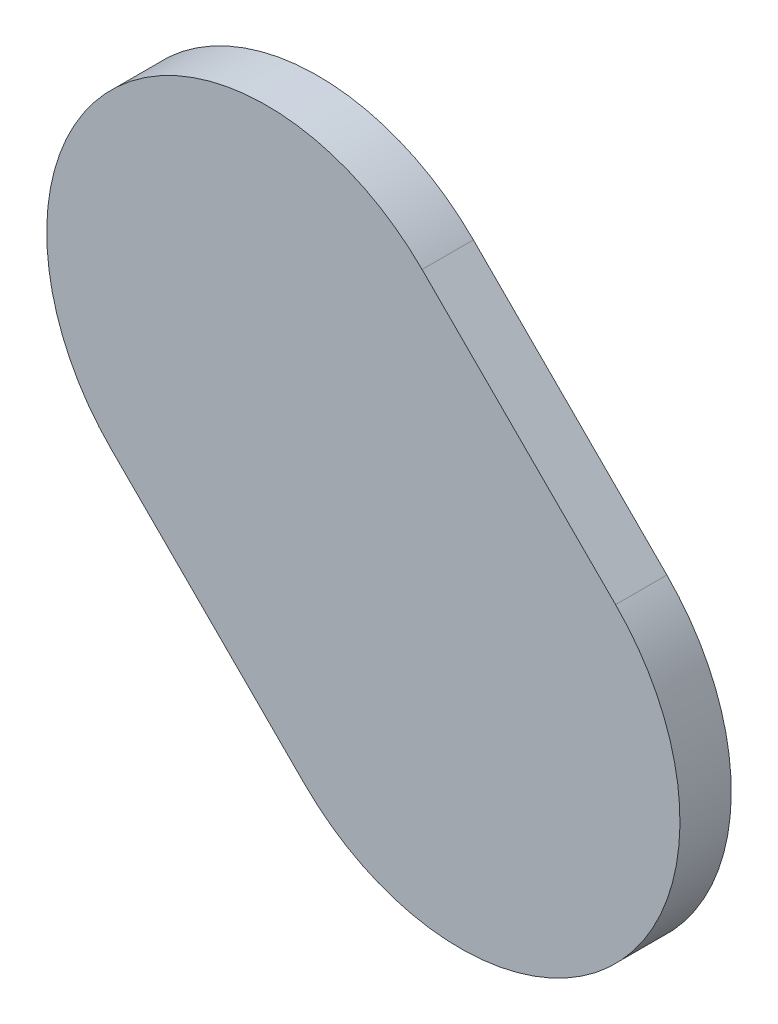
ISO-10303-21;
HEADER;
FILE_DESCRIPTION(('STEP AP214'),'2;1');
FILE_NAME('part.step','',(''),(''),'','','');
FILE_SCHEMA(('AUTOMOTIVE_DESIGN { 1 0 10303 214 1 1 1 1 }'));
ENDSEC;
DATA;
#1=APPLICATION_CONTEXT('core data for automotive mechanical design processes');
#2=APPLICATION_PROTOCOL_DEFINITION('international standard','automotive_design',2000,#1);
#3=PRODUCT_CONTEXT('',#1,'mechanical');
#4=PRODUCT('Part','Part','',(#3));
#5=PRODUCT_RELATED_PRODUCT_CATEGORY('part','',(#4));
#6=PRODUCT_DEFINITION_FORMATION('','',#4);
#7=PRODUCT_DEFINITION_CONTEXT('part definition',#1,'design');
#8=PRODUCT_DEFINITION('design','',#6,#7);
#9=PRODUCT_DEFINITION_SHAPE('','',#8);
#10=(LENGTH_UNIT() NAMED_UNIT(*) SI_UNIT(.MILLI.,.METRE.));
#11=(NAMED_UNIT(*) PLANE_ANGLE_UNIT() SI_UNIT($,.RADIAN.));
#12=(NAMED_UNIT(*) SI_UNIT($,.STERADIAN.) SOLID_ANGLE_UNIT());
#13=UNCERTAINTY_MEASURE_WITH_UNIT(LENGTH_MEASURE(1.E-05),#10,'distance_accuracy_value','');
#14=(GEOMETRIC_REPRESENTATION_CONTEXT(3) GLOBAL_UNCERTAINTY_ASSIGNED_CONTEXT((#13)) GLOBAL_UNIT_ASSIGNED_CONTEXT((#10,
#11,#12)) REPRESENTATION_CONTEXT('',''));
#15=CARTESIAN_POINT('',(0.,0.,0.));
#16=DIRECTION('',(0.,0.,1.));
#17=DIRECTION('',(1.,0.,0.));
#18=AXIS2_PLACEMENT_3D('',#15,#16,#17);
#19=CARTESIAN_POINT('',(133.406066,-119.482978,1.635));
#20=DIRECTION('',(0.,0.,1.));
#21=DIRECTION('',(1.,0.,0.));
#22=AXIS2_PLACEMENT_3D('',#19,#20,#21);
#23=PLANE('',#22);
#24=DIRECTION('',(-0.707106781186548,0.707106781186548,0.));
#25=VECTOR('',#24,1.);
#26=CARTESIAN_POINT('',(133.406066,-119.482978,1.635));
#27=LINE('',#26,#25);
#28=CARTESIAN_POINT('',(133.406066,-119.482978,1.635));
#29=VERTEX_POINT('',#28);
#30=CARTESIAN_POINT('',(133.274066,-119.350978,1.635));
#31=VERTEX_POINT('',#30);
#32=EDGE_CURVE('E82',#29,#31,#27,.T.);
#33=ORIENTED_EDGE('',*,*,#32,.T.);
#34=CARTESIAN_POINT('',(133.1679995,-119.4570445,1.635));
#35=DIRECTION('',(0.,0.,1.));
#36=DIRECTION('',(0.707106781186548,0.707106781186548,0.));
#37=AXIS2_PLACEMENT_3D('',#34,#35,#36);
#38=CIRCLE('',#37,0.150000682813);
#39=CARTESIAN_POINT('',(133.061933,-119.563111,1.635));
#40=VERTEX_POINT('',#39);
#41=EDGE_CURVE('E103',#31,#40,#38,.T.);
#42=ORIENTED_EDGE('',*,*,#41,.T.);
#43=DIRECTION('',(0.707106781186548,-0.707106781186548,0.));
#44=VECTOR('',#43,1.);
#45=CARTESIAN_POINT('',(133.061933,-119.563111,1.635));
#46=LINE('',#45,#44);
#47=CARTESIAN_POINT('',(133.193933,-119.695111,1.635));
#48=VERTEX_POINT('',#47);
#49=EDGE_CURVE('E74',#40,#48,#46,.T.);
#50=ORIENTED_EDGE('',*,*,#49,.T.);
#51=CARTESIAN_POINT('',(133.2999995,-119.5890445,1.635));
#52=DIRECTION('',(0.,0.,1.));
#53=DIRECTION('',(-0.707106781187048,-0.707106781186048,0.));
#54=AXIS2_PLACEMENT_3D('',#51,#52,#53);
#55=CIRCLE('',#54,0.150000682813);
#56=EDGE_CURVE('E11',#48,#29,#55,.T.);
#57=ORIENTED_EDGE('',*,*,#56,.T.);
#58=EDGE_LOOP('',(#33,#42,#50,#57));
#59=FACE_BOUND('',#58,.T.);
#60=ADVANCED_FACE('F17',(#59),#23,.T.);
#61=CARTESIAN_POINT('',(133.406066,-119.482978,1.6));
#62=DIRECTION('',(0.,0.,1.));
#63=DIRECTION('',(1.,0.,0.));
#64=AXIS2_PLACEMENT_3D('',#61,#62,#63);
#65=PLANE('',#64);
#66=CARTESIAN_POINT('',(133.2999995,-119.5890445,1.6));
#67=DIRECTION('',(0.,0.,1.));
#68=DIRECTION('',(-0.707106781187048,-0.707106781186048,0.));
#69=AXIS2_PLACEMENT_3D('',#66,#67,#68);
#70=CIRCLE('',#69,0.150000682813);
#71=CARTESIAN_POINT('',(133.193933,-119.695111,1.6));
#72=VERTEX_POINT('',#71);
#73=CARTESIAN_POINT('',(133.406066,-119.482978,1.6));
#74=VERTEX_POINT('',#73);
#75=EDGE_CURVE('E25',#72,#74,#70,.T.);
#76=ORIENTED_EDGE('',*,*,#75,.F.);
#77=DIRECTION('',(0.707106781186548,-0.707106781186548,0.));
#78=VECTOR('',#77,1.);
#79=CARTESIAN_POINT('',(133.061933,-119.563111,1.6));
#80=LINE('',#79,#78);
#81=CARTESIAN_POINT('',(133.061933,-119.563111,1.6));
#82=VERTEX_POINT('',#81);
#83=EDGE_CURVE('E100',#82,#72,#80,.T.);
#84=ORIENTED_EDGE('',*,*,#83,.F.);
#85=CARTESIAN_POINT('',(133.1679995,-119.4570445,1.6));
#86=DIRECTION('',(0.,0.,1.));
#87=DIRECTION('',(0.707106781186548,0.707106781186548,0.));
#88=AXIS2_PLACEMENT_3D('',#85,#86,#87);
#89=CIRCLE('',#88,0.150000682813);
#90=CARTESIAN_POINT('',(133.274066,-119.350978,1.6));
#91=VERTEX_POINT('',#90);
#92=EDGE_CURVE('E84',#91,#82,#89,.T.);
#93=ORIENTED_EDGE('',*,*,#92,.F.);
#94=DIRECTION('',(-0.707106781186548,0.707106781186548,0.));
#95=VECTOR('',#94,1.);
#96=CARTESIAN_POINT('',(133.406066,-119.482978,1.6));
#97=LINE('',#96,#95);
#98=EDGE_CURVE('E80',#74,#91,#97,.T.);
#99=ORIENTED_EDGE('',*,*,#98,.F.);
#100=EDGE_LOOP('',(#76,#84,#93,#99));
#101=FACE_BOUND('',#100,.T.);
#102=ADVANCED_FACE('F86',(#101),#65,.F.);
#103=CARTESIAN_POINT('',(133.2999995,-119.5890445,1.6));
#104=DIRECTION('',(0.,0.,-1.));
#105=DIRECTION('',(-0.707106781187048,-0.707106781186048,0.));
#106=AXIS2_PLACEMENT_3D('',#103,#104,#105);
#107=CYLINDRICAL_SURFACE('',#106,0.150000682813);
#108=ORIENTED_EDGE('',*,*,#75,.T.);
#109=DIRECTION('',(0.,0.,1.));
#110=VECTOR('',#109,1.);
#111=CARTESIAN_POINT('',(133.406066,-119.482978,1.6));
#112=LINE('',#111,#110);
#113=EDGE_CURVE('E68',#74,#29,#112,.T.);
#114=ORIENTED_EDGE('',*,*,#113,.T.);
#115=ORIENTED_EDGE('',*,*,#56,.F.);
#116=DIRECTION('',(0.,0.,1.));
#117=VECTOR('',#116,1.);
#118=CARTESIAN_POINT('',(133.193933,-119.695111,1.6));
#119=LINE('',#118,#117);
#120=EDGE_CURVE('E71',#72,#48,#119,.T.);
#121=ORIENTED_EDGE('',*,*,#120,.F.);
#122=EDGE_LOOP('',(#108,#114,#115,#121));
#123=FACE_BOUND('',#122,.T.);
#124=ADVANCED_FACE('F67',(#123),#107,.T.);
#125=CARTESIAN_POINT('',(133.061933,-119.563111,1.6));
#126=DIRECTION('',(0.707106781186548,0.707106781186548,0.));
#127=DIRECTION('',(0.,0.,-1.));
#128=AXIS2_PLACEMENT_3D('',#125,#126,#127);
#129=PLANE('',#128);
#130=ORIENTED_EDGE('',*,*,#83,.T.);
#131=ORIENTED_EDGE('',*,*,#120,.T.);
#132=ORIENTED_EDGE('',*,*,#49,.F.);
#133=DIRECTION('',(0.,0.,1.));
#134=VECTOR('',#133,1.);
#135=CARTESIAN_POINT('',(133.061933,-119.563111,1.6));
#136=LINE('',#135,#134);
#137=EDGE_CURVE('E106',#82,#40,#136,.T.);
#138=ORIENTED_EDGE('',*,*,#137,.F.);
#139=EDGE_LOOP('',(#130,#131,#132,#138));
#140=FACE_BOUND('',#139,.T.);
#141=ADVANCED_FACE('F120',(#140),#129,.F.);
#142=CARTESIAN_POINT('',(133.1679995,-119.4570445,1.6));
#143=DIRECTION('',(0.,0.,-1.));
#144=DIRECTION('',(0.707106781186548,0.707106781186548,0.));
#145=AXIS2_PLACEMENT_3D('',#142,#143,#144);
#146=CYLINDRICAL_SURFACE('',#145,0.150000682813);
#147=ORIENTED_EDGE('',*,*,#92,.T.);
#148=ORIENTED_EDGE('',*,*,#137,.T.);
#149=ORIENTED_EDGE('',*,*,#41,.F.);
#150=DIRECTION('',(0.,0.,1.));
#151=VECTOR('',#150,1.);
#152=CARTESIAN_POINT('',(133.274066,-119.350978,1.6));
#153=LINE('',#152,#151);
#154=EDGE_CURVE('E90',#91,#31,#153,.T.);
#155=ORIENTED_EDGE('',*,*,#154,.F.);
#156=EDGE_LOOP('',(#147,#148,#149,#155));
#157=FACE_BOUND('',#156,.T.);
#158=ADVANCED_FACE('F122',(#157),#146,.T.);
#159=CARTESIAN_POINT('',(133.406066,-119.482978,1.6));
#160=DIRECTION('',(-0.707106781186548,-0.707106781186548,0.));
#161=DIRECTION('',(-0.707106781186548,0.707106781186548,0.));
#162=AXIS2_PLACEMENT_3D('',#159,#160,#161);
#163=PLANE('',#162);
#164=ORIENTED_EDGE('',*,*,#98,.T.);
#165=ORIENTED_EDGE('',*,*,#154,.T.);
#166=ORIENTED_EDGE('',*,*,#32,.F.);
#167=ORIENTED_EDGE('',*,*,#113,.F.);
#168=EDGE_LOOP('',(#164,#165,#166,#167));
#169=FACE_BOUND('',#168,.T.);
#170=ADVANCED_FACE('F78',(#169),#163,.F.);
#171=CLOSED_SHELL('',(#60,#102,#124,#141,#158,#170));
#172=MANIFOLD_SOLID_BREP('B1',#171);
#173=ADVANCED_BREP_SHAPE_REPRESENTATION('',(#18,#172),#14);
#174=SHAPE_DEFINITION_REPRESENTATION(#9,#173);
ENDSEC;
END-ISO-10303-21;
